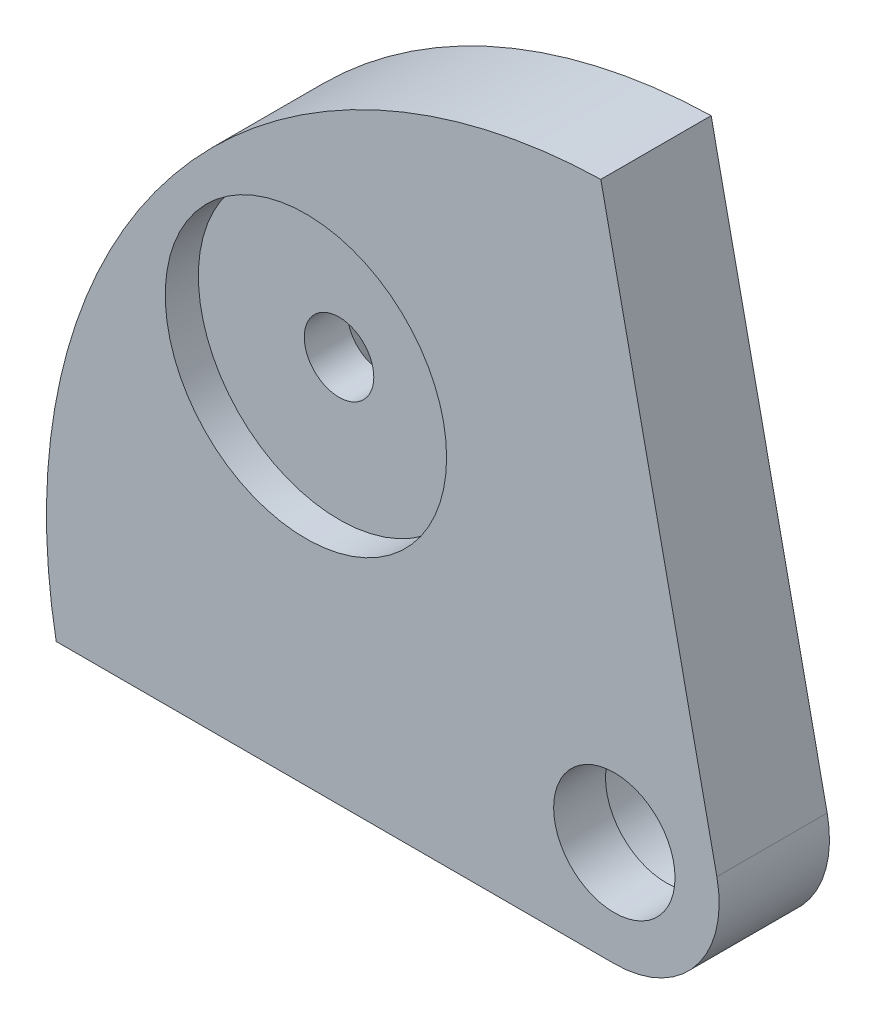
ISO-10303-21;
HEADER;
FILE_DESCRIPTION(('STEP AP214'),'2;1');
FILE_NAME('part.step','',(''),(''),'','','');
FILE_SCHEMA(('AUTOMOTIVE_DESIGN { 1 0 10303 214 1 1 1 1 }'));
ENDSEC;
DATA;
#1=APPLICATION_CONTEXT('core data for automotive mechanical design processes');
#2=APPLICATION_PROTOCOL_DEFINITION('international standard','automotive_design',2000,#1);
#3=PRODUCT_CONTEXT('',#1,'mechanical');
#4=PRODUCT('Part','Part','',(#3));
#5=PRODUCT_RELATED_PRODUCT_CATEGORY('part','',(#4));
#6=PRODUCT_DEFINITION_FORMATION('','',#4);
#7=PRODUCT_DEFINITION_CONTEXT('part definition',#1,'design');
#8=PRODUCT_DEFINITION('design','',#6,#7);
#9=PRODUCT_DEFINITION_SHAPE('','',#8);
#10=(LENGTH_UNIT() NAMED_UNIT(*) SI_UNIT(.MILLI.,.METRE.));
#11=(NAMED_UNIT(*) PLANE_ANGLE_UNIT() SI_UNIT($,.RADIAN.));
#12=(NAMED_UNIT(*) SI_UNIT($,.STERADIAN.) SOLID_ANGLE_UNIT());
#13=UNCERTAINTY_MEASURE_WITH_UNIT(LENGTH_MEASURE(1.E-05),#10,'distance_accuracy_value','');
#14=(GEOMETRIC_REPRESENTATION_CONTEXT(3) GLOBAL_UNCERTAINTY_ASSIGNED_CONTEXT((#13)) GLOBAL_UNIT_ASSIGNED_CONTEXT((#10,
#11,#12)) REPRESENTATION_CONTEXT('',''));
#15=CARTESIAN_POINT('',(0.,0.,0.));
#16=DIRECTION('',(0.,0.,1.));
#17=DIRECTION('',(1.,0.,0.));
#18=AXIS2_PLACEMENT_3D('',#15,#16,#17);
#19=CARTESIAN_POINT('',(-27.9511875826117,22.6344254132376,0.));
#20=DIRECTION('',(0.,0.,-1.));
#21=DIRECTION('',(-1.,0.,0.));
#22=AXIS2_PLACEMENT_3D('',#19,#20,#21);
#23=CYLINDRICAL_SURFACE('',#22,3.14999999999999);
#24=CARTESIAN_POINT('',(-27.9511875826117,22.6344254132376,3.1));
#25=DIRECTION('',(0.,0.,-1.));
#26=DIRECTION('',(-1.,0.,0.));
#27=AXIS2_PLACEMENT_3D('',#24,#25,#26);
#28=CIRCLE('',#27,3.15);
#29=CARTESIAN_POINT('',(-31.1011875826117,22.6344254132376,3.1));
#30=VERTEX_POINT('',#29);
#31=EDGE_CURVE('E114',#30,#30,#28,.T.);
#32=ORIENTED_EDGE('',*,*,#31,.T.);
#33=EDGE_LOOP('',(#32));
#34=FACE_BOUND('',#33,.T.);
#35=CARTESIAN_POINT('',(-27.9511875826117,22.6344254132376,7.));
#36=DIRECTION('',(0.,0.,1.));
#37=DIRECTION('',(1.,0.,0.));
#38=AXIS2_PLACEMENT_3D('',#35,#36,#37);
#39=CIRCLE('',#38,3.14999999999999);
#40=CARTESIAN_POINT('',(-24.8011875826117,22.6344254132376,7.));
#41=VERTEX_POINT('',#40);
#42=EDGE_CURVE('E36',#41,#41,#39,.F.);
#43=ORIENTED_EDGE('',*,*,#42,.F.);
#44=EDGE_LOOP('',(#43));
#45=FACE_BOUND('',#44,.T.);
#46=ADVANCED_FACE('F32',(#34,#45),#23,.F.);
#47=CARTESIAN_POINT('',(0.,0.,10.));
#48=DIRECTION('',(0.,0.,-1.));
#49=DIRECTION('',(-1.,0.,0.));
#50=AXIS2_PLACEMENT_3D('',#47,#48,#49);
#51=CYLINDRICAL_SURFACE('',#50,5.5);
#52=CARTESIAN_POINT('',(0.,0.,10.));
#53=DIRECTION('',(0.,0.,1.));
#54=DIRECTION('',(1.,0.,0.));
#55=AXIS2_PLACEMENT_3D('',#52,#53,#54);
#56=CIRCLE('',#55,5.5);
#57=CARTESIAN_POINT('',(5.5,0.,10.));
#58=VERTEX_POINT('',#57);
#59=EDGE_CURVE('E102',#58,#58,#56,.T.);
#60=ORIENTED_EDGE('',*,*,#59,.T.);
#61=EDGE_LOOP('',(#60));
#62=FACE_BOUND('',#61,.T.);
#63=CARTESIAN_POINT('',(0.,0.,5.3));
#64=DIRECTION('',(0.,0.,-1.));
#65=DIRECTION('',(-1.,0.,0.));
#66=AXIS2_PLACEMENT_3D('',#63,#64,#65);
#67=CIRCLE('',#66,5.5);
#68=CARTESIAN_POINT('',(-5.5,0.,5.3));
#69=VERTEX_POINT('',#68);
#70=EDGE_CURVE('E107',#69,#69,#67,.T.);
#71=ORIENTED_EDGE('',*,*,#70,.T.);
#72=EDGE_LOOP('',(#71));
#73=FACE_BOUND('',#72,.T.);
#74=ADVANCED_FACE('F132',(#62,#73),#51,.F.);
#75=CARTESIAN_POINT('',(0.,0.,10.));
#76=DIRECTION('',(0.,0.,1.));
#77=DIRECTION('',(1.,0.,0.));
#78=AXIS2_PLACEMENT_3D('',#75,#76,#77);
#79=PLANE('',#78);
#80=CARTESIAN_POINT('',(-27.9511875826117,22.6344254132376,10.));
#81=DIRECTION('',(0.,0.,1.));
#82=DIRECTION('',(1.,0.,0.));
#83=AXIS2_PLACEMENT_3D('',#80,#81,#82);
#84=CIRCLE('',#83,12.75);
#85=CARTESIAN_POINT('',(-15.2011875826117,22.6344254132376,10.));
#86=VERTEX_POINT('',#85);
#87=EDGE_CURVE('E124',#86,#86,#84,.T.);
#88=ORIENTED_EDGE('',*,*,#87,.F.);
#89=EDGE_LOOP('',(#88));
#90=FACE_BOUND('',#89,.T.);
#91=ORIENTED_EDGE('',*,*,#59,.F.);
#92=EDGE_LOOP('',(#91));
#93=FACE_BOUND('',#92,.T.);
#94=CARTESIAN_POINT('',(0.,0.,10.));
#95=DIRECTION('',(0.,0.,1.));
#96=DIRECTION('',(1.,0.,0.));
#97=AXIS2_PLACEMENT_3D('',#94,#95,#96);
#98=CIRCLE('',#97,9.5);
#99=CARTESIAN_POINT('',(0.,-9.5,10.));
#100=VERTEX_POINT('',#99);
#101=CARTESIAN_POINT('',(9.29240220697117,1.97516106276866,10.));
#102=VERTEX_POINT('',#101);
#103=EDGE_CURVE('E86',#100,#102,#98,.T.);
#104=ORIENTED_EDGE('',*,*,#103,.T.);
#105=DIRECTION('',(-0.207911690817757,0.978147600733806,0.));
#106=VECTOR('',#105,1.);
#107=CARTESIAN_POINT('',(9.29240220697117,1.97516106276866,10.));
#108=LINE('',#107,#106);
#109=CARTESIAN_POINT('',(-1.22420250619416,51.45189624581,10.));
#110=VERTEX_POINT('',#109);
#111=EDGE_CURVE('E81',#102,#110,#108,.T.);
#112=ORIENTED_EDGE('',*,*,#111,.T.);
#113=CARTESIAN_POINT('',(0.,0.,10.));
#114=DIRECTION('',(0.,0.,1.));
#115=DIRECTION('',(1.,0.,0.));
#116=AXIS2_PLACEMENT_3D('',#113,#114,#115);
#117=CIRCLE('',#116,51.466458);
#118=CARTESIAN_POINT('',(-50.5820748790099,-9.5,10.));
#119=VERTEX_POINT('',#118);
#120=EDGE_CURVE('E84',#110,#119,#117,.T.);
#121=ORIENTED_EDGE('',*,*,#120,.T.);
#122=DIRECTION('',(1.,0.,0.));
#123=VECTOR('',#122,1.);
#124=CARTESIAN_POINT('',(0.,-9.5,10.));
#125=LINE('',#124,#123);
#126=EDGE_CURVE('E51',#119,#100,#125,.T.);
#127=ORIENTED_EDGE('',*,*,#126,.T.);
#128=EDGE_LOOP('',(#104,#112,#121,#127));
#129=FACE_BOUND('',#128,.T.);
#130=ADVANCED_FACE('F82',(#90,#93,#129),#79,.T.);
#131=CARTESIAN_POINT('',(0.,0.,0.));
#132=DIRECTION('',(0.,0.,1.));
#133=DIRECTION('',(1.,0.,0.));
#134=AXIS2_PLACEMENT_3D('',#131,#132,#133);
#135=PLANE('',#134);
#136=CARTESIAN_POINT('',(0.,0.,0.));
#137=DIRECTION('',(0.,0.,-1.));
#138=DIRECTION('',(-1.,0.,0.));
#139=AXIS2_PLACEMENT_3D('',#136,#137,#138);
#140=CIRCLE('',#139,6.65);
#141=CARTESIAN_POINT('',(-6.65,0.,0.));
#142=VERTEX_POINT('',#141);
#143=EDGE_CURVE('E117',#142,#142,#140,.T.);
#144=ORIENTED_EDGE('',*,*,#143,.F.);
#145=EDGE_LOOP('',(#144));
#146=FACE_BOUND('',#145,.T.);
#147=CARTESIAN_POINT('',(0.,0.,0.));
#148=DIRECTION('',(0.,0.,1.));
#149=DIRECTION('',(1.,0.,0.));
#150=AXIS2_PLACEMENT_3D('',#147,#148,#149);
#151=CIRCLE('',#150,9.5);
#152=CARTESIAN_POINT('',(0.,-9.5,0.));
#153=VERTEX_POINT('',#152);
#154=CARTESIAN_POINT('',(9.29240220697117,1.97516106276866,0.));
#155=VERTEX_POINT('',#154);
#156=EDGE_CURVE('E99',#153,#155,#151,.T.);
#157=ORIENTED_EDGE('',*,*,#156,.F.);
#158=DIRECTION('',(1.,0.,0.));
#159=VECTOR('',#158,1.);
#160=CARTESIAN_POINT('',(0.,-9.5,0.));
#161=LINE('',#160,#159);
#162=CARTESIAN_POINT('',(-50.5820748790099,-9.5,0.));
#163=VERTEX_POINT('',#162);
#164=EDGE_CURVE('E74',#163,#153,#161,.T.);
#165=ORIENTED_EDGE('',*,*,#164,.F.);
#166=CARTESIAN_POINT('',(0.,0.,0.));
#167=DIRECTION('',(0.,0.,1.));
#168=DIRECTION('',(1.,0.,0.));
#169=AXIS2_PLACEMENT_3D('',#166,#167,#168);
#170=CIRCLE('',#169,51.466458);
#171=CARTESIAN_POINT('',(-1.22420250619416,51.45189624581,0.));
#172=VERTEX_POINT('',#171);
#173=EDGE_CURVE('E68',#172,#163,#170,.T.);
#174=ORIENTED_EDGE('',*,*,#173,.F.);
#175=DIRECTION('',(-0.207911690817757,0.978147600733806,0.));
#176=VECTOR('',#175,1.);
#177=CARTESIAN_POINT('',(9.29240220697117,1.97516106276866,0.));
#178=LINE('',#177,#176);
#179=EDGE_CURVE('E90',#155,#172,#178,.T.);
#180=ORIENTED_EDGE('',*,*,#179,.F.);
#181=EDGE_LOOP('',(#157,#165,#174,#180));
#182=FACE_BOUND('',#181,.T.);
#183=CARTESIAN_POINT('',(-27.9511875826117,22.6344254132376,0.));
#184=DIRECTION('',(0.,0.,-1.));
#185=DIRECTION('',(-1.,0.,0.));
#186=AXIS2_PLACEMENT_3D('',#183,#184,#185);
#187=CIRCLE('',#186,6.25);
#188=CARTESIAN_POINT('',(-34.2011875826117,22.6344254132376,0.));
#189=VERTEX_POINT('',#188);
#190=EDGE_CURVE('E109',#189,#189,#187,.T.);
#191=ORIENTED_EDGE('',*,*,#190,.F.);
#192=EDGE_LOOP('',(#191));
#193=FACE_BOUND('',#192,.T.);
#194=ADVANCED_FACE('F135',(#146,#182,#193),#135,.F.);
#195=CARTESIAN_POINT('',(0.,0.,10.));
#196=DIRECTION('',(0.,0.,-1.));
#197=DIRECTION('',(-1.,0.,0.));
#198=AXIS2_PLACEMENT_3D('',#195,#196,#197);
#199=CYLINDRICAL_SURFACE('',#198,9.5);
#200=ORIENTED_EDGE('',*,*,#156,.T.);
#201=DIRECTION('',(0.,0.,-1.));
#202=VECTOR('',#201,1.);
#203=CARTESIAN_POINT('',(9.29240220697117,1.97516106276866,10.));
#204=LINE('',#203,#202);
#205=EDGE_CURVE('E11',#102,#155,#204,.T.);
#206=ORIENTED_EDGE('',*,*,#205,.F.);
#207=ORIENTED_EDGE('',*,*,#103,.F.);
#208=DIRECTION('',(0.,0.,-1.));
#209=VECTOR('',#208,1.);
#210=CARTESIAN_POINT('',(0.,-9.5,10.));
#211=LINE('',#210,#209);
#212=EDGE_CURVE('E95',#100,#153,#211,.T.);
#213=ORIENTED_EDGE('',*,*,#212,.T.);
#214=EDGE_LOOP('',(#200,#206,#207,#213));
#215=FACE_BOUND('',#214,.T.);
#216=ADVANCED_FACE('F34',(#215),#199,.T.);
#217=CARTESIAN_POINT('',(9.29240220697117,1.97516106276866,10.));
#218=DIRECTION('',(-0.978147600733806,-0.207911690817757,0.));
#219=DIRECTION('',(0.207911690817757,-0.978147600733806,0.));
#220=AXIS2_PLACEMENT_3D('',#217,#218,#219);
#221=PLANE('',#220);
#222=ORIENTED_EDGE('',*,*,#179,.T.);
#223=DIRECTION('',(0.,0.,-1.));
#224=VECTOR('',#223,1.);
#225=CARTESIAN_POINT('',(-1.22420250619416,51.45189624581,10.));
#226=LINE('',#225,#224);
#227=EDGE_CURVE('E42',#110,#172,#226,.T.);
#228=ORIENTED_EDGE('',*,*,#227,.F.);
#229=ORIENTED_EDGE('',*,*,#111,.F.);
#230=ORIENTED_EDGE('',*,*,#205,.T.);
#231=EDGE_LOOP('',(#222,#228,#229,#230));
#232=FACE_BOUND('',#231,.T.);
#233=ADVANCED_FACE('F89',(#232),#221,.F.);
#234=CARTESIAN_POINT('',(0.,0.,10.));
#235=DIRECTION('',(0.,0.,-1.));
#236=DIRECTION('',(-1.,0.,0.));
#237=AXIS2_PLACEMENT_3D('',#234,#235,#236);
#238=CYLINDRICAL_SURFACE('',#237,51.466458);
#239=ORIENTED_EDGE('',*,*,#173,.T.);
#240=DIRECTION('',(0.,0.,-1.));
#241=VECTOR('',#240,1.);
#242=CARTESIAN_POINT('',(-50.5820748790099,-9.5,10.));
#243=LINE('',#242,#241);
#244=EDGE_CURVE('E91',#119,#163,#243,.T.);
#245=ORIENTED_EDGE('',*,*,#244,.F.);
#246=ORIENTED_EDGE('',*,*,#120,.F.);
#247=ORIENTED_EDGE('',*,*,#227,.T.);
#248=EDGE_LOOP('',(#239,#245,#246,#247));
#249=FACE_BOUND('',#248,.T.);
#250=ADVANCED_FACE('F93',(#249),#238,.T.);
#251=CARTESIAN_POINT('',(0.,-9.5,10.));
#252=DIRECTION('',(0.,1.,0.));
#253=DIRECTION('',(-1.,0.,0.));
#254=AXIS2_PLACEMENT_3D('',#251,#252,#253);
#255=PLANE('',#254);
#256=ORIENTED_EDGE('',*,*,#164,.T.);
#257=ORIENTED_EDGE('',*,*,#212,.F.);
#258=ORIENTED_EDGE('',*,*,#126,.F.);
#259=ORIENTED_EDGE('',*,*,#244,.T.);
#260=EDGE_LOOP('',(#256,#257,#258,#259));
#261=FACE_BOUND('',#260,.T.);
#262=ADVANCED_FACE('F159',(#261),#255,.F.);
#263=CARTESIAN_POINT('',(-27.9511875826117,22.6344254132376,0.));
#264=DIRECTION('',(0.,0.,-1.));
#265=DIRECTION('',(-1.,0.,0.));
#266=AXIS2_PLACEMENT_3D('',#263,#264,#265);
#267=CONICAL_SURFACE('',#266,6.25,0.785398163397448);
#268=ORIENTED_EDGE('',*,*,#31,.F.);
#269=EDGE_LOOP('',(#268));
#270=FACE_BOUND('',#269,.T.);
#271=ORIENTED_EDGE('',*,*,#190,.T.);
#272=EDGE_LOOP('',(#271));
#273=FACE_BOUND('',#272,.T.);
#274=ADVANCED_FACE('F155',(#270,#273),#267,.F.);
#275=CARTESIAN_POINT('',(0.,0.,5.3));
#276=DIRECTION('',(0.,0.,-1.));
#277=DIRECTION('',(-1.,0.,0.));
#278=AXIS2_PLACEMENT_3D('',#275,#276,#277);
#279=CYLINDRICAL_SURFACE('',#278,6.65);
#280=CARTESIAN_POINT('',(0.,0.,5.3));
#281=DIRECTION('',(0.,0.,-1.));
#282=DIRECTION('',(-1.,0.,0.));
#283=AXIS2_PLACEMENT_3D('',#280,#281,#282);
#284=CIRCLE('',#283,6.65);
#285=CARTESIAN_POINT('',(-6.65,0.,5.3));
#286=VERTEX_POINT('',#285);
#287=EDGE_CURVE('E110',#286,#286,#284,.T.);
#288=ORIENTED_EDGE('',*,*,#287,.F.);
#289=EDGE_LOOP('',(#288));
#290=FACE_BOUND('',#289,.T.);
#291=ORIENTED_EDGE('',*,*,#143,.T.);
#292=EDGE_LOOP('',(#291));
#293=FACE_BOUND('',#292,.T.);
#294=ADVANCED_FACE('F158',(#290,#293),#279,.F.);
#295=CARTESIAN_POINT('',(0.,0.,5.3));
#296=DIRECTION('',(0.,0.,-1.));
#297=DIRECTION('',(-1.,0.,0.));
#298=AXIS2_PLACEMENT_3D('',#295,#296,#297);
#299=PLANE('',#298);
#300=ORIENTED_EDGE('',*,*,#70,.F.);
#301=EDGE_LOOP('',(#300));
#302=FACE_BOUND('',#301,.T.);
#303=ORIENTED_EDGE('',*,*,#287,.T.);
#304=EDGE_LOOP('',(#303));
#305=FACE_BOUND('',#304,.T.);
#306=ADVANCED_FACE('F163',(#302,#305),#299,.T.);
#307=CARTESIAN_POINT('',(-27.9511875826117,22.6344254132376,7.));
#308=DIRECTION('',(0.,0.,1.));
#309=DIRECTION('',(1.,0.,0.));
#310=AXIS2_PLACEMENT_3D('',#307,#308,#309);
#311=PLANE('',#310);
#312=CARTESIAN_POINT('',(-27.9511875826117,22.6344254132376,7.));
#313=DIRECTION('',(0.,0.,1.));
#314=DIRECTION('',(1.,0.,0.));
#315=AXIS2_PLACEMENT_3D('',#312,#313,#314);
#316=CIRCLE('',#315,12.75);
#317=CARTESIAN_POINT('',(-15.2011875826117,22.6344254132376,7.));
#318=VERTEX_POINT('',#317);
#319=EDGE_CURVE('E180',#318,#318,#316,.T.);
#320=ORIENTED_EDGE('',*,*,#319,.T.);
#321=EDGE_LOOP('',(#320));
#322=FACE_BOUND('',#321,.T.);
#323=ORIENTED_EDGE('',*,*,#42,.T.);
#324=EDGE_LOOP('',(#323));
#325=FACE_BOUND('',#324,.T.);
#326=ADVANCED_FACE('F167',(#322,#325),#311,.T.);
#327=CARTESIAN_POINT('',(-27.9511875826117,22.6344254132376,7.));
#328=DIRECTION('',(0.,0.,1.));
#329=DIRECTION('',(1.,0.,0.));
#330=AXIS2_PLACEMENT_3D('',#327,#328,#329);
#331=CYLINDRICAL_SURFACE('',#330,12.75);
#332=ORIENTED_EDGE('',*,*,#319,.F.);
#333=EDGE_LOOP('',(#332));
#334=FACE_BOUND('',#333,.T.);
#335=ORIENTED_EDGE('',*,*,#87,.T.);
#336=EDGE_LOOP('',(#335));
#337=FACE_BOUND('',#336,.T.);
#338=ADVANCED_FACE('F169',(#334,#337),#331,.F.);
#339=CLOSED_SHELL('',(#46,#74,#130,#194,#216,#233,#250,#262,#274,#294,#306,#326,#338));
#340=MANIFOLD_SOLID_BREP('B2',#339);
#341=ADVANCED_BREP_SHAPE_REPRESENTATION('',(#18,#340),#14);
#342=SHAPE_DEFINITION_REPRESENTATION(#9,#341);
ENDSEC;
END-ISO-10303-21;
